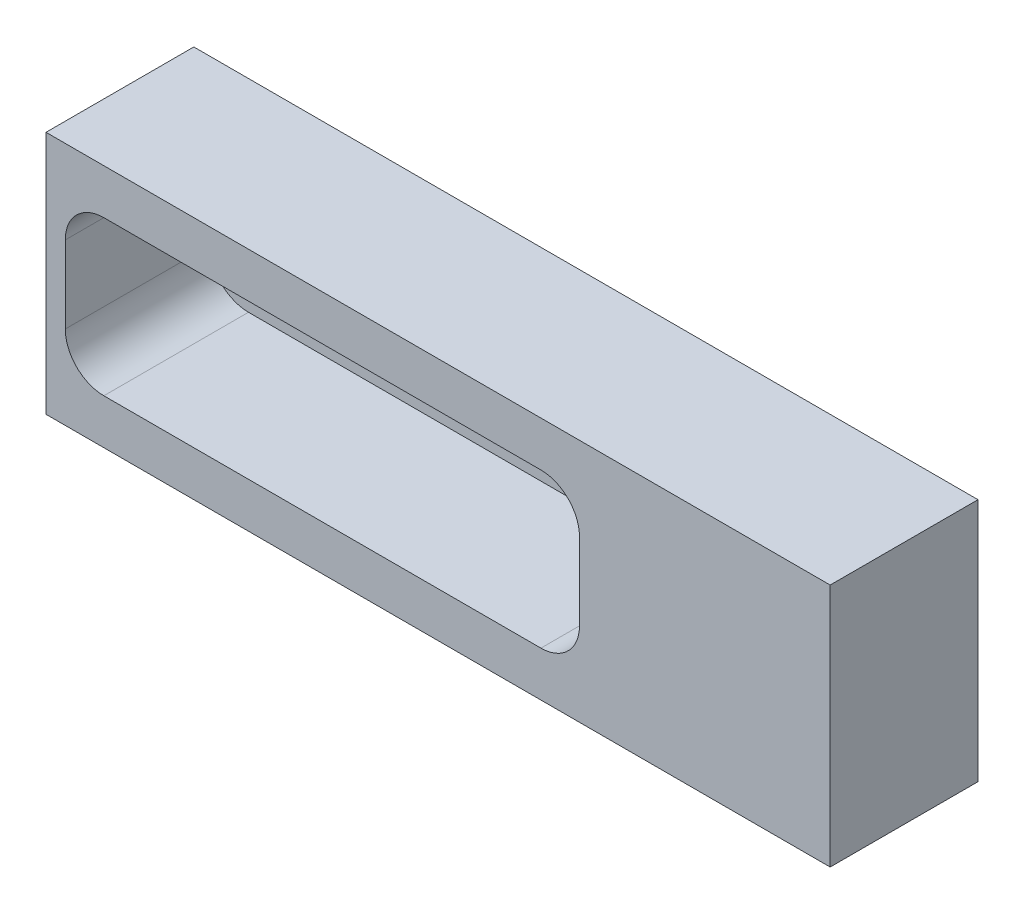
ISO-10303-21;
HEADER;
FILE_DESCRIPTION(('STEP AP214'),'2;1');
FILE_NAME('part.step','',(''),(''),'','','');
FILE_SCHEMA(('AUTOMOTIVE_DESIGN { 1 0 10303 214 1 1 1 1 }'));
ENDSEC;
DATA;
#1=APPLICATION_CONTEXT('core data for automotive mechanical design processes');
#2=APPLICATION_PROTOCOL_DEFINITION('international standard','automotive_design',2000,#1);
#3=PRODUCT_CONTEXT('',#1,'mechanical');
#4=PRODUCT('Part','Part','',(#3));
#5=PRODUCT_RELATED_PRODUCT_CATEGORY('part','',(#4));
#6=PRODUCT_DEFINITION_FORMATION('','',#4);
#7=PRODUCT_DEFINITION_CONTEXT('part definition',#1,'design');
#8=PRODUCT_DEFINITION('design','',#6,#7);
#9=PRODUCT_DEFINITION_SHAPE('','',#8);
#10=(LENGTH_UNIT() NAMED_UNIT(*) SI_UNIT(.MILLI.,.METRE.));
#11=(NAMED_UNIT(*) PLANE_ANGLE_UNIT() SI_UNIT($,.RADIAN.));
#12=(NAMED_UNIT(*) SI_UNIT($,.STERADIAN.) SOLID_ANGLE_UNIT());
#13=UNCERTAINTY_MEASURE_WITH_UNIT(LENGTH_MEASURE(1.E-05),#10,'distance_accuracy_value','');
#14=(GEOMETRIC_REPRESENTATION_CONTEXT(3) GLOBAL_UNCERTAINTY_ASSIGNED_CONTEXT((#13)) GLOBAL_UNIT_ASSIGNED_CONTEXT((#10,
#11,#12)) REPRESENTATION_CONTEXT('',''));
#15=CARTESIAN_POINT('',(0.,0.,0.));
#16=DIRECTION('',(0.,0.,1.));
#17=DIRECTION('',(1.,0.,0.));
#18=AXIS2_PLACEMENT_3D('',#15,#16,#17);
#19=CARTESIAN_POINT('',(122.,-19.,-12.5));
#20=DIRECTION('',(0.,0.,1.));
#21=DIRECTION('',(1.,0.,0.));
#22=AXIS2_PLACEMENT_3D('',#19,#20,#21);
#23=PLANE('',#22);
#24=DIRECTION('',(0.,1.,0.));
#25=VECTOR('',#24,1.);
#26=CARTESIAN_POINT('',(2.,19.,-12.5));
#27=LINE('',#26,#25);
#28=CARTESIAN_POINT('',(2.,-17.,-12.5));
#29=VERTEX_POINT('',#28);
#30=CARTESIAN_POINT('',(2.,17.,-12.5));
#31=VERTEX_POINT('',#30);
#32=EDGE_CURVE('E214',#29,#31,#27,.T.);
#33=ORIENTED_EDGE('',*,*,#32,.T.);
#34=DIRECTION('',(1.,0.,0.));
#35=VECTOR('',#34,1.);
#36=CARTESIAN_POINT('',(122.,17.,-12.5));
#37=LINE('',#36,#35);
#38=CARTESIAN_POINT('',(120.,17.,-12.5));
#39=VERTEX_POINT('',#38);
#40=EDGE_CURVE('E220',#31,#39,#37,.T.);
#41=ORIENTED_EDGE('',*,*,#40,.T.);
#42=DIRECTION('',(0.,-1.,0.));
#43=VECTOR('',#42,1.);
#44=CARTESIAN_POINT('',(120.,-19.,-12.5));
#45=LINE('',#44,#43);
#46=CARTESIAN_POINT('',(120.,-17.,-12.5));
#47=VERTEX_POINT('',#46);
#48=EDGE_CURVE('E218',#39,#47,#45,.T.);
#49=ORIENTED_EDGE('',*,*,#48,.T.);
#50=DIRECTION('',(-1.,0.,0.));
#51=VECTOR('',#50,1.);
#52=CARTESIAN_POINT('',(122.,-17.,-12.5));
#53=LINE('',#52,#51);
#54=EDGE_CURVE('E216',#47,#29,#53,.T.);
#55=ORIENTED_EDGE('',*,*,#54,.T.);
#56=EDGE_LOOP('',(#33,#41,#49,#55));
#57=FACE_BOUND('',#56,.T.);
#58=CARTESIAN_POINT('',(43.,0.,-12.5));
#59=DIRECTION('',(0.,0.,1.));
#60=DIRECTION('',(1.,0.,0.));
#61=AXIS2_PLACEMENT_3D('',#58,#59,#60);
#62=CIRCLE('',#61,9.2);
#63=CARTESIAN_POINT('',(52.2,0.,-12.5));
#64=VERTEX_POINT('',#63);
#65=EDGE_CURVE('E239',#64,#64,#62,.T.);
#66=ORIENTED_EDGE('',*,*,#65,.T.);
#67=EDGE_LOOP('',(#66));
#68=FACE_BOUND('',#67,.T.);
#69=ADVANCED_FACE('F38',(#57,#68),#23,.F.);
#70=CARTESIAN_POINT('',(122.,19.,12.5));
#71=DIRECTION('',(0.,-1.,0.));
#72=DIRECTION('',(0.,0.,-1.));
#73=AXIS2_PLACEMENT_3D('',#70,#71,#72);
#74=PLANE('',#73);
#75=DIRECTION('',(0.,0.,1.));
#76=VECTOR('',#75,1.);
#77=CARTESIAN_POINT('',(122.,19.,12.5));
#78=LINE('',#77,#76);
#79=CARTESIAN_POINT('',(122.,19.,-10.5));
#80=VERTEX_POINT('',#79);
#81=CARTESIAN_POINT('',(122.,19.,12.5));
#82=VERTEX_POINT('',#81);
#83=EDGE_CURVE('E140',#80,#82,#78,.T.);
#84=ORIENTED_EDGE('',*,*,#83,.F.);
#85=DIRECTION('',(-1.,0.,0.));
#86=VECTOR('',#85,1.);
#87=CARTESIAN_POINT('',(122.,19.,-10.5));
#88=LINE('',#87,#86);
#89=CARTESIAN_POINT('',(0.,19.,-10.5));
#90=VERTEX_POINT('',#89);
#91=EDGE_CURVE('E212',#80,#90,#88,.T.);
#92=ORIENTED_EDGE('',*,*,#91,.T.);
#93=DIRECTION('',(0.,0.,1.));
#94=VECTOR('',#93,1.);
#95=CARTESIAN_POINT('',(0.,19.,12.5));
#96=LINE('',#95,#94);
#97=CARTESIAN_POINT('',(0.,19.,12.5));
#98=VERTEX_POINT('',#97);
#99=EDGE_CURVE('E156',#90,#98,#96,.T.);
#100=ORIENTED_EDGE('',*,*,#99,.T.);
#101=DIRECTION('',(-1.,0.,0.));
#102=VECTOR('',#101,1.);
#103=CARTESIAN_POINT('',(122.,19.,12.5));
#104=LINE('',#103,#102);
#105=EDGE_CURVE('E154',#82,#98,#104,.T.);
#106=ORIENTED_EDGE('',*,*,#105,.F.);
#107=EDGE_LOOP('',(#84,#92,#100,#106));
#108=FACE_BOUND('',#107,.T.);
#109=ADVANCED_FACE('F155',(#108),#74,.F.);
#110=CARTESIAN_POINT('',(122.,-19.,12.5));
#111=DIRECTION('',(0.,0.,-1.));
#112=DIRECTION('',(-1.,0.,0.));
#113=AXIS2_PLACEMENT_3D('',#110,#111,#112);
#114=PLANE('',#113);
#115=DIRECTION('',(-1.,0.,0.));
#116=VECTOR('',#115,1.);
#117=CARTESIAN_POINT('',(3.,12.,12.5));
#118=LINE('',#117,#116);
#119=CARTESIAN_POINT('',(77.,12.,12.5));
#120=VERTEX_POINT('',#119);
#121=CARTESIAN_POINT('',(9.,12.,12.5));
#122=VERTEX_POINT('',#121);
#123=EDGE_CURVE('E260',#120,#122,#118,.T.);
#124=ORIENTED_EDGE('',*,*,#123,.F.);
#125=CARTESIAN_POINT('',(77.,6.,12.5));
#126=DIRECTION('',(0.,0.,-1.));
#127=DIRECTION('',(-1.,0.,0.));
#128=AXIS2_PLACEMENT_3D('',#125,#126,#127);
#129=CIRCLE('',#128,6.);
#130=CARTESIAN_POINT('',(83.,6.,12.5));
#131=VERTEX_POINT('',#130);
#132=EDGE_CURVE('E210',#120,#131,#129,.T.);
#133=ORIENTED_EDGE('',*,*,#132,.T.);
#134=DIRECTION('',(0.,1.,0.));
#135=VECTOR('',#134,1.);
#136=CARTESIAN_POINT('',(83.,-12.,12.5));
#137=LINE('',#136,#135);
#138=CARTESIAN_POINT('',(83.,-6.,12.5));
#139=VERTEX_POINT('',#138);
#140=EDGE_CURVE('E244',#139,#131,#137,.T.);
#141=ORIENTED_EDGE('',*,*,#140,.F.);
#142=CARTESIAN_POINT('',(77.,-6.,12.5));
#143=DIRECTION('',(0.,0.,-1.));
#144=DIRECTION('',(-1.,0.,0.));
#145=AXIS2_PLACEMENT_3D('',#142,#143,#144);
#146=CIRCLE('',#145,6.);
#147=CARTESIAN_POINT('',(77.,-12.,12.5));
#148=VERTEX_POINT('',#147);
#149=EDGE_CURVE('E201',#139,#148,#146,.T.);
#150=ORIENTED_EDGE('',*,*,#149,.T.);
#151=DIRECTION('',(1.,0.,0.));
#152=VECTOR('',#151,1.);
#153=CARTESIAN_POINT('',(3.,-12.,12.5));
#154=LINE('',#153,#152);
#155=CARTESIAN_POINT('',(9.,-12.,12.5));
#156=VERTEX_POINT('',#155);
#157=EDGE_CURVE('E251',#156,#148,#154,.T.);
#158=ORIENTED_EDGE('',*,*,#157,.F.);
#159=CARTESIAN_POINT('',(9.,-6.,12.5));
#160=DIRECTION('',(0.,0.,-1.));
#161=DIRECTION('',(-1.,0.,0.));
#162=AXIS2_PLACEMENT_3D('',#159,#160,#161);
#163=CIRCLE('',#162,6.);
#164=CARTESIAN_POINT('',(3.,-6.,12.5));
#165=VERTEX_POINT('',#164);
#166=EDGE_CURVE('E192',#156,#165,#163,.T.);
#167=ORIENTED_EDGE('',*,*,#166,.T.);
#168=DIRECTION('',(0.,-1.,0.));
#169=VECTOR('',#168,1.);
#170=CARTESIAN_POINT('',(3.,-12.,12.5));
#171=LINE('',#170,#169);
#172=CARTESIAN_POINT('',(3.,6.,12.5));
#173=VERTEX_POINT('',#172);
#174=EDGE_CURVE('E262',#173,#165,#171,.T.);
#175=ORIENTED_EDGE('',*,*,#174,.F.);
#176=CARTESIAN_POINT('',(9.,6.,12.5));
#177=DIRECTION('',(0.,0.,-1.));
#178=DIRECTION('',(-1.,0.,0.));
#179=AXIS2_PLACEMENT_3D('',#176,#177,#178);
#180=CIRCLE('',#179,6.);
#181=EDGE_CURVE('E182',#173,#122,#180,.T.);
#182=ORIENTED_EDGE('',*,*,#181,.T.);
#183=EDGE_LOOP('',(#124,#133,#141,#150,#158,#167,#175,#182));
#184=FACE_BOUND('',#183,.T.);
#185=DIRECTION('',(0.,-1.,0.));
#186=VECTOR('',#185,1.);
#187=CARTESIAN_POINT('',(0.,-19.,12.5));
#188=LINE('',#187,#186);
#189=CARTESIAN_POINT('',(0.,-19.,12.5));
#190=VERTEX_POINT('',#189);
#191=EDGE_CURVE('E170',#98,#190,#188,.T.);
#192=ORIENTED_EDGE('',*,*,#191,.T.);
#193=DIRECTION('',(-1.,0.,0.));
#194=VECTOR('',#193,1.);
#195=CARTESIAN_POINT('',(122.,-19.,12.5));
#196=LINE('',#195,#194);
#197=CARTESIAN_POINT('',(122.,-19.,12.5));
#198=VERTEX_POINT('',#197);
#199=EDGE_CURVE('E160',#198,#190,#196,.T.);
#200=ORIENTED_EDGE('',*,*,#199,.F.);
#201=DIRECTION('',(0.,-1.,0.));
#202=VECTOR('',#201,1.);
#203=CARTESIAN_POINT('',(122.,-19.,12.5));
#204=LINE('',#203,#202);
#205=EDGE_CURVE('E144',#82,#198,#204,.T.);
#206=ORIENTED_EDGE('',*,*,#205,.F.);
#207=ORIENTED_EDGE('',*,*,#105,.T.);
#208=EDGE_LOOP('',(#192,#200,#206,#207));
#209=FACE_BOUND('',#208,.T.);
#210=ADVANCED_FACE('F162',(#184,#209),#114,.F.);
#211=CARTESIAN_POINT('',(122.,-19.,12.5));
#212=DIRECTION('',(0.,1.,0.));
#213=DIRECTION('',(0.,0.,1.));
#214=AXIS2_PLACEMENT_3D('',#211,#212,#213);
#215=PLANE('',#214);
#216=DIRECTION('',(0.,0.,-1.));
#217=VECTOR('',#216,1.);
#218=CARTESIAN_POINT('',(0.,-19.,12.5));
#219=LINE('',#218,#217);
#220=CARTESIAN_POINT('',(0.,-19.,-10.5));
#221=VERTEX_POINT('',#220);
#222=EDGE_CURVE('E151',#190,#221,#219,.T.);
#223=ORIENTED_EDGE('',*,*,#222,.T.);
#224=DIRECTION('',(1.,0.,0.));
#225=VECTOR('',#224,1.);
#226=CARTESIAN_POINT('',(122.,-19.,-10.5));
#227=LINE('',#226,#225);
#228=CARTESIAN_POINT('',(122.,-19.,-10.5));
#229=VERTEX_POINT('',#228);
#230=EDGE_CURVE('E47',#221,#229,#227,.T.);
#231=ORIENTED_EDGE('',*,*,#230,.T.);
#232=DIRECTION('',(0.,0.,-1.));
#233=VECTOR('',#232,1.);
#234=CARTESIAN_POINT('',(122.,-19.,12.5));
#235=LINE('',#234,#233);
#236=EDGE_CURVE('E164',#198,#229,#235,.T.);
#237=ORIENTED_EDGE('',*,*,#236,.F.);
#238=ORIENTED_EDGE('',*,*,#199,.T.);
#239=EDGE_LOOP('',(#223,#231,#237,#238));
#240=FACE_BOUND('',#239,.T.);
#241=ADVANCED_FACE('F305',(#240),#215,.F.);
#242=CARTESIAN_POINT('',(122.,0.,0.));
#243=DIRECTION('',(-1.,0.,0.));
#244=DIRECTION('',(0.,0.,1.));
#245=AXIS2_PLACEMENT_3D('',#242,#243,#244);
#246=PLANE('',#245);
#247=ORIENTED_EDGE('',*,*,#236,.T.);
#248=DIRECTION('',(0.,1.,0.));
#249=VECTOR('',#248,1.);
#250=CARTESIAN_POINT('',(122.,0.,-10.5));
#251=LINE('',#250,#249);
#252=EDGE_CURVE('E147',#229,#80,#251,.T.);
#253=ORIENTED_EDGE('',*,*,#252,.T.);
#254=ORIENTED_EDGE('',*,*,#83,.T.);
#255=ORIENTED_EDGE('',*,*,#205,.T.);
#256=EDGE_LOOP('',(#247,#253,#254,#255));
#257=FACE_BOUND('',#256,.T.);
#258=ADVANCED_FACE('F142',(#257),#246,.F.);
#259=CARTESIAN_POINT('',(0.,0.,0.));
#260=DIRECTION('',(-1.,0.,0.));
#261=DIRECTION('',(0.,0.,1.));
#262=AXIS2_PLACEMENT_3D('',#259,#260,#261);
#263=PLANE('',#262);
#264=ORIENTED_EDGE('',*,*,#99,.F.);
#265=DIRECTION('',(0.,-1.,0.));
#266=VECTOR('',#265,1.);
#267=CARTESIAN_POINT('',(0.,-19.,-10.5));
#268=LINE('',#267,#266);
#269=EDGE_CURVE('E11',#90,#221,#268,.T.);
#270=ORIENTED_EDGE('',*,*,#269,.T.);
#271=ORIENTED_EDGE('',*,*,#222,.F.);
#272=ORIENTED_EDGE('',*,*,#191,.F.);
#273=EDGE_LOOP('',(#264,#270,#271,#272));
#274=FACE_BOUND('',#273,.T.);
#275=ADVANCED_FACE('F350',(#274),#263,.T.);
#276=CARTESIAN_POINT('',(83.,-12.,-10.));
#277=DIRECTION('',(1.,0.,0.));
#278=DIRECTION('',(0.,0.,-1.));
#279=AXIS2_PLACEMENT_3D('',#276,#277,#278);
#280=PLANE('',#279);
#281=ORIENTED_EDGE('',*,*,#140,.T.);
#282=DIRECTION('',(0.,0.,1.));
#283=VECTOR('',#282,1.);
#284=CARTESIAN_POINT('',(83.,6.,-10.));
#285=LINE('',#284,#283);
#286=CARTESIAN_POINT('',(83.,6.,-10.));
#287=VERTEX_POINT('',#286);
#288=EDGE_CURVE('E206',#131,#287,#285,.F.);
#289=ORIENTED_EDGE('',*,*,#288,.T.);
#290=DIRECTION('',(0.,1.,0.));
#291=VECTOR('',#290,1.);
#292=CARTESIAN_POINT('',(83.,-12.,-10.));
#293=LINE('',#292,#291);
#294=CARTESIAN_POINT('',(83.,-6.,-10.));
#295=VERTEX_POINT('',#294);
#296=EDGE_CURVE('E247',#295,#287,#293,.T.);
#297=ORIENTED_EDGE('',*,*,#296,.F.);
#298=DIRECTION('',(0.,0.,1.));
#299=VECTOR('',#298,1.);
#300=CARTESIAN_POINT('',(83.,-6.,12.5));
#301=LINE('',#300,#299);
#302=EDGE_CURVE('E194',#295,#139,#301,.T.);
#303=ORIENTED_EDGE('',*,*,#302,.T.);
#304=EDGE_LOOP('',(#281,#289,#297,#303));
#305=FACE_BOUND('',#304,.T.);
#306=ADVANCED_FACE('F281',(#305),#280,.F.);
#307=CARTESIAN_POINT('',(3.,-12.,-10.));
#308=DIRECTION('',(0.,-1.,0.));
#309=DIRECTION('',(0.,0.,-1.));
#310=AXIS2_PLACEMENT_3D('',#307,#308,#309);
#311=PLANE('',#310);
#312=ORIENTED_EDGE('',*,*,#157,.T.);
#313=DIRECTION('',(0.,0.,1.));
#314=VECTOR('',#313,1.);
#315=CARTESIAN_POINT('',(77.,-12.,-10.));
#316=LINE('',#315,#314);
#317=CARTESIAN_POINT('',(77.,-12.,-10.));
#318=VERTEX_POINT('',#317);
#319=EDGE_CURVE('E197',#148,#318,#316,.F.);
#320=ORIENTED_EDGE('',*,*,#319,.T.);
#321=DIRECTION('',(1.,0.,0.));
#322=VECTOR('',#321,1.);
#323=CARTESIAN_POINT('',(3.,-12.,-10.));
#324=LINE('',#323,#322);
#325=CARTESIAN_POINT('',(9.,-12.,-10.));
#326=VERTEX_POINT('',#325);
#327=EDGE_CURVE('E171',#326,#318,#324,.T.);
#328=ORIENTED_EDGE('',*,*,#327,.F.);
#329=DIRECTION('',(0.,0.,1.));
#330=VECTOR('',#329,1.);
#331=CARTESIAN_POINT('',(9.,-12.,12.5));
#332=LINE('',#331,#330);
#333=EDGE_CURVE('E185',#326,#156,#332,.T.);
#334=ORIENTED_EDGE('',*,*,#333,.T.);
#335=EDGE_LOOP('',(#312,#320,#328,#334));
#336=FACE_BOUND('',#335,.T.);
#337=ADVANCED_FACE('F268',(#336),#311,.F.);
#338=CARTESIAN_POINT('',(3.,-12.,-10.));
#339=DIRECTION('',(-1.,0.,0.));
#340=DIRECTION('',(0.,0.,1.));
#341=AXIS2_PLACEMENT_3D('',#338,#339,#340);
#342=PLANE('',#341);
#343=ORIENTED_EDGE('',*,*,#174,.T.);
#344=DIRECTION('',(0.,0.,1.));
#345=VECTOR('',#344,1.);
#346=CARTESIAN_POINT('',(3.,-6.,-10.));
#347=LINE('',#346,#345);
#348=CARTESIAN_POINT('',(3.,-6.,-10.));
#349=VERTEX_POINT('',#348);
#350=EDGE_CURVE('E188',#165,#349,#347,.F.);
#351=ORIENTED_EDGE('',*,*,#350,.T.);
#352=DIRECTION('',(0.,-1.,0.));
#353=VECTOR('',#352,1.);
#354=CARTESIAN_POINT('',(3.,-12.,-10.));
#355=LINE('',#354,#353);
#356=CARTESIAN_POINT('',(3.,6.,-10.));
#357=VERTEX_POINT('',#356);
#358=EDGE_CURVE('E253',#357,#349,#355,.T.);
#359=ORIENTED_EDGE('',*,*,#358,.F.);
#360=DIRECTION('',(0.,0.,1.));
#361=VECTOR('',#360,1.);
#362=CARTESIAN_POINT('',(3.,6.,12.5));
#363=LINE('',#362,#361);
#364=EDGE_CURVE('E159',#357,#173,#363,.T.);
#365=ORIENTED_EDGE('',*,*,#364,.T.);
#366=EDGE_LOOP('',(#343,#351,#359,#365));
#367=FACE_BOUND('',#366,.T.);
#368=ADVANCED_FACE('F299',(#367),#342,.F.);
#369=CARTESIAN_POINT('',(3.,12.,-10.));
#370=DIRECTION('',(0.,1.,0.));
#371=DIRECTION('',(0.,0.,1.));
#372=AXIS2_PLACEMENT_3D('',#369,#370,#371);
#373=PLANE('',#372);
#374=DIRECTION('',(-1.,0.,0.));
#375=VECTOR('',#374,1.);
#376=CARTESIAN_POINT('',(3.,12.,-10.));
#377=LINE('',#376,#375);
#378=CARTESIAN_POINT('',(77.,12.,-10.));
#379=VERTEX_POINT('',#378);
#380=CARTESIAN_POINT('',(9.,12.,-10.));
#381=VERTEX_POINT('',#380);
#382=EDGE_CURVE('E250',#379,#381,#377,.T.);
#383=ORIENTED_EDGE('',*,*,#382,.F.);
#384=DIRECTION('',(0.,0.,1.));
#385=VECTOR('',#384,1.);
#386=CARTESIAN_POINT('',(77.,12.,12.5));
#387=LINE('',#386,#385);
#388=EDGE_CURVE('E203',#379,#120,#387,.T.);
#389=ORIENTED_EDGE('',*,*,#388,.T.);
#390=ORIENTED_EDGE('',*,*,#123,.T.);
#391=DIRECTION('',(0.,0.,1.));
#392=VECTOR('',#391,1.);
#393=CARTESIAN_POINT('',(9.,12.,-10.));
#394=LINE('',#393,#392);
#395=EDGE_CURVE('E177',#122,#381,#394,.F.);
#396=ORIENTED_EDGE('',*,*,#395,.T.);
#397=EDGE_LOOP('',(#383,#389,#390,#396));
#398=FACE_BOUND('',#397,.T.);
#399=ADVANCED_FACE('F289',(#398),#373,.F.);
#400=CARTESIAN_POINT('',(0.,0.,-10.));
#401=DIRECTION('',(0.,0.,-1.));
#402=DIRECTION('',(-1.,0.,0.));
#403=AXIS2_PLACEMENT_3D('',#400,#401,#402);
#404=PLANE('',#403);
#405=CARTESIAN_POINT('',(43.,0.,-10.));
#406=DIRECTION('',(0.,0.,1.));
#407=DIRECTION('',(1.,0.,0.));
#408=AXIS2_PLACEMENT_3D('',#405,#406,#407);
#409=CIRCLE('',#408,9.2);
#410=CARTESIAN_POINT('',(52.2,0.,-10.));
#411=VERTEX_POINT('',#410);
#412=EDGE_CURVE('E234',#411,#411,#409,.T.);
#413=ORIENTED_EDGE('',*,*,#412,.F.);
#414=EDGE_LOOP('',(#413));
#415=FACE_BOUND('',#414,.T.);
#416=ORIENTED_EDGE('',*,*,#296,.T.);
#417=CARTESIAN_POINT('',(77.,6.,-10.));
#418=DIRECTION('',(0.,0.,-1.));
#419=DIRECTION('',(-1.,0.,0.));
#420=AXIS2_PLACEMENT_3D('',#417,#418,#419);
#421=CIRCLE('',#420,6.);
#422=EDGE_CURVE('E208',#287,#379,#421,.F.);
#423=ORIENTED_EDGE('',*,*,#422,.T.);
#424=ORIENTED_EDGE('',*,*,#382,.T.);
#425=CARTESIAN_POINT('',(9.,6.,-10.));
#426=DIRECTION('',(0.,0.,-1.));
#427=DIRECTION('',(-1.,0.,0.));
#428=AXIS2_PLACEMENT_3D('',#425,#426,#427);
#429=CIRCLE('',#428,6.);
#430=EDGE_CURVE('E180',#381,#357,#429,.F.);
#431=ORIENTED_EDGE('',*,*,#430,.T.);
#432=ORIENTED_EDGE('',*,*,#358,.T.);
#433=CARTESIAN_POINT('',(9.,-6.,-10.));
#434=DIRECTION('',(0.,0.,-1.));
#435=DIRECTION('',(-1.,0.,0.));
#436=AXIS2_PLACEMENT_3D('',#433,#434,#435);
#437=CIRCLE('',#436,6.);
#438=EDGE_CURVE('E190',#349,#326,#437,.F.);
#439=ORIENTED_EDGE('',*,*,#438,.T.);
#440=ORIENTED_EDGE('',*,*,#327,.T.);
#441=CARTESIAN_POINT('',(77.,-6.,-10.));
#442=DIRECTION('',(0.,0.,-1.));
#443=DIRECTION('',(-1.,0.,0.));
#444=AXIS2_PLACEMENT_3D('',#441,#442,#443);
#445=CIRCLE('',#444,6.);
#446=EDGE_CURVE('E199',#318,#295,#445,.F.);
#447=ORIENTED_EDGE('',*,*,#446,.T.);
#448=EDGE_LOOP('',(#416,#423,#424,#431,#432,#439,#440,#447));
#449=FACE_BOUND('',#448,.T.);
#450=ADVANCED_FACE('F278',(#415,#449),#404,.F.);
#451=CARTESIAN_POINT('',(9.,6.,-10.));
#452=DIRECTION('',(0.,0.,-1.));
#453=DIRECTION('',(-1.,0.,0.));
#454=AXIS2_PLACEMENT_3D('',#451,#452,#453);
#455=CYLINDRICAL_SURFACE('',#454,6.);
#456=ORIENTED_EDGE('',*,*,#430,.F.);
#457=ORIENTED_EDGE('',*,*,#395,.F.);
#458=ORIENTED_EDGE('',*,*,#181,.F.);
#459=ORIENTED_EDGE('',*,*,#364,.F.);
#460=EDGE_LOOP('',(#456,#457,#458,#459));
#461=FACE_BOUND('',#460,.T.);
#462=ADVANCED_FACE('F295',(#461),#455,.F.);
#463=CARTESIAN_POINT('',(9.,-6.,-10.));
#464=DIRECTION('',(0.,0.,-1.));
#465=DIRECTION('',(-1.,0.,0.));
#466=AXIS2_PLACEMENT_3D('',#463,#464,#465);
#467=CYLINDRICAL_SURFACE('',#466,6.);
#468=ORIENTED_EDGE('',*,*,#438,.F.);
#469=ORIENTED_EDGE('',*,*,#350,.F.);
#470=ORIENTED_EDGE('',*,*,#166,.F.);
#471=ORIENTED_EDGE('',*,*,#333,.F.);
#472=EDGE_LOOP('',(#468,#469,#470,#471));
#473=FACE_BOUND('',#472,.T.);
#474=ADVANCED_FACE('F303',(#473),#467,.F.);
#475=CARTESIAN_POINT('',(77.,-6.,-10.));
#476=DIRECTION('',(0.,0.,-1.));
#477=DIRECTION('',(-1.,0.,0.));
#478=AXIS2_PLACEMENT_3D('',#475,#476,#477);
#479=CYLINDRICAL_SURFACE('',#478,6.);
#480=ORIENTED_EDGE('',*,*,#446,.F.);
#481=ORIENTED_EDGE('',*,*,#319,.F.);
#482=ORIENTED_EDGE('',*,*,#149,.F.);
#483=ORIENTED_EDGE('',*,*,#302,.F.);
#484=EDGE_LOOP('',(#480,#481,#482,#483));
#485=FACE_BOUND('',#484,.T.);
#486=ADVANCED_FACE('F274',(#485),#479,.F.);
#487=CARTESIAN_POINT('',(77.,6.,-10.));
#488=DIRECTION('',(0.,0.,-1.));
#489=DIRECTION('',(-1.,0.,0.));
#490=AXIS2_PLACEMENT_3D('',#487,#488,#489);
#491=CYLINDRICAL_SURFACE('',#490,6.);
#492=ORIENTED_EDGE('',*,*,#422,.F.);
#493=ORIENTED_EDGE('',*,*,#288,.F.);
#494=ORIENTED_EDGE('',*,*,#132,.F.);
#495=ORIENTED_EDGE('',*,*,#388,.F.);
#496=EDGE_LOOP('',(#492,#493,#494,#495));
#497=FACE_BOUND('',#496,.T.);
#498=ADVANCED_FACE('F285',(#497),#491,.F.);
#499=CARTESIAN_POINT('',(43.,0.,-12.5));
#500=DIRECTION('',(0.,0.,1.));
#501=DIRECTION('',(1.,0.,0.));
#502=AXIS2_PLACEMENT_3D('',#499,#500,#501);
#503=CYLINDRICAL_SURFACE('',#502,9.2);
#504=ORIENTED_EDGE('',*,*,#65,.F.);
#505=EDGE_LOOP('',(#504));
#506=FACE_BOUND('',#505,.T.);
#507=ORIENTED_EDGE('',*,*,#412,.T.);
#508=EDGE_LOOP('',(#507));
#509=FACE_BOUND('',#508,.T.);
#510=ADVANCED_FACE('F328',(#506,#509),#503,.F.);
#511=CARTESIAN_POINT('',(122.,-17.,-12.5));
#512=DIRECTION('',(0.,0.707106781186551,0.707106781186544));
#513=DIRECTION('',(-1.,0.,0.));
#514=AXIS2_PLACEMENT_3D('',#511,#512,#513);
#515=PLANE('',#514);
#516=DIRECTION('',(0.577350269189625,0.577350269189624,-0.577350269189629));
#517=VECTOR('',#516,1.);
#518=CARTESIAN_POINT('',(1.33333333333334,-17.6666666666667,-11.8333333333333));
#519=LINE('',#518,#517);
#520=EDGE_CURVE('E228',#29,#221,#519,.F.);
#521=ORIENTED_EDGE('',*,*,#520,.F.);
#522=ORIENTED_EDGE('',*,*,#54,.F.);
#523=DIRECTION('',(0.577350269189625,-0.577350269189624,0.577350269189629));
#524=VECTOR('',#523,1.);
#525=CARTESIAN_POINT('',(120.666666666667,-17.6666666666667,-11.8333333333333));
#526=LINE('',#525,#524);
#527=EDGE_CURVE('E42',#229,#47,#526,.F.);
#528=ORIENTED_EDGE('',*,*,#527,.F.);
#529=ORIENTED_EDGE('',*,*,#230,.F.);
#530=EDGE_LOOP('',(#521,#522,#528,#529));
#531=FACE_BOUND('',#530,.T.);
#532=ADVANCED_FACE('F40',(#531),#515,.F.);
#533=CARTESIAN_POINT('',(122.,0.,-10.5));
#534=DIRECTION('',(-0.70710678118655,0.,0.707106781186545));
#535=DIRECTION('',(0.,1.,0.));
#536=AXIS2_PLACEMENT_3D('',#533,#534,#535);
#537=PLANE('',#536);
#538=ORIENTED_EDGE('',*,*,#527,.T.);
#539=ORIENTED_EDGE('',*,*,#48,.F.);
#540=DIRECTION('',(0.577350269189624,0.577350269189625,0.577350269189628));
#541=VECTOR('',#540,1.);
#542=CARTESIAN_POINT('',(115.666666666667,12.6666666666667,-16.8333333333333));
#543=LINE('',#542,#541);
#544=EDGE_CURVE('E227',#80,#39,#543,.F.);
#545=ORIENTED_EDGE('',*,*,#544,.F.);
#546=ORIENTED_EDGE('',*,*,#252,.F.);
#547=EDGE_LOOP('',(#538,#539,#545,#546));
#548=FACE_BOUND('',#547,.T.);
#549=ADVANCED_FACE('F335',(#548),#537,.F.);
#550=CARTESIAN_POINT('',(2.,-19.,-12.5));
#551=DIRECTION('',(-0.70710678118655,0.,-0.707106781186545));
#552=DIRECTION('',(0.,-1.,0.));
#553=AXIS2_PLACEMENT_3D('',#550,#551,#552);
#554=PLANE('',#553);
#555=ORIENTED_EDGE('',*,*,#520,.T.);
#556=ORIENTED_EDGE('',*,*,#269,.F.);
#557=DIRECTION('',(-0.577350269189624,0.577350269189625,0.577350269189628));
#558=VECTOR('',#557,1.);
#559=CARTESIAN_POINT('',(14.,5.00000000000003,-24.5));
#560=LINE('',#559,#558);
#561=EDGE_CURVE('E225',#31,#90,#560,.T.);
#562=ORIENTED_EDGE('',*,*,#561,.F.);
#563=ORIENTED_EDGE('',*,*,#32,.F.);
#564=EDGE_LOOP('',(#555,#556,#562,#563));
#565=FACE_BOUND('',#564,.T.);
#566=ADVANCED_FACE('F332',(#565),#554,.T.);
#567=CARTESIAN_POINT('',(122.,19.,-10.5));
#568=DIRECTION('',(0.,-0.707106781186549,0.707106781186546));
#569=DIRECTION('',(-1.,0.,0.));
#570=AXIS2_PLACEMENT_3D('',#567,#568,#569);
#571=PLANE('',#570);
#572=ORIENTED_EDGE('',*,*,#544,.T.);
#573=ORIENTED_EDGE('',*,*,#40,.F.);
#574=ORIENTED_EDGE('',*,*,#561,.T.);
#575=ORIENTED_EDGE('',*,*,#91,.F.);
#576=EDGE_LOOP('',(#572,#573,#574,#575));
#577=FACE_BOUND('',#576,.T.);
#578=ADVANCED_FACE('F329',(#577),#571,.F.);
#579=CLOSED_SHELL('',(#69,#109,#210,#241,#258,#275,#306,#337,#368,#399,#450,#462,#474,#486,#498,
#510,#532,#549,#566,#578));
#580=MANIFOLD_SOLID_BREP('B2',#579);
#581=ADVANCED_BREP_SHAPE_REPRESENTATION('',(#18,#580),#14);
#582=SHAPE_DEFINITION_REPRESENTATION(#9,#581);
ENDSEC;
END-ISO-10303-21;
